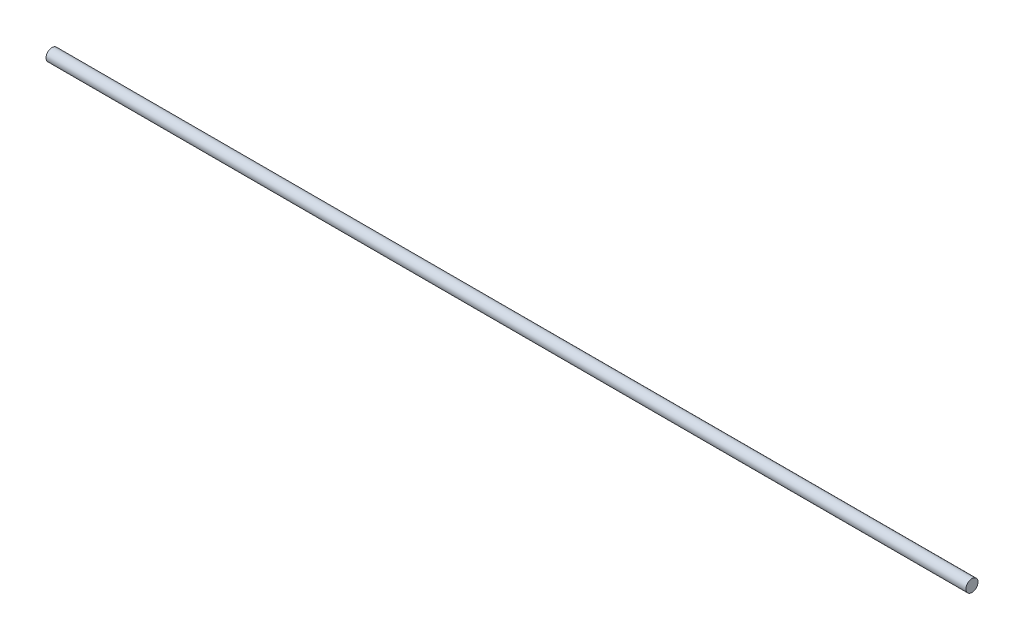
ISO-10303-21;
HEADER;
FILE_DESCRIPTION(('STEP AP214'),'2;1');
FILE_NAME('part.step','',(''),(''),'','','');
FILE_SCHEMA(('AUTOMOTIVE_DESIGN { 1 0 10303 214 1 1 1 1 }'));
ENDSEC;
DATA;
#1=APPLICATION_CONTEXT('core data for automotive mechanical design processes');
#2=APPLICATION_PROTOCOL_DEFINITION('international standard','automotive_design',2000,#1);
#3=PRODUCT_CONTEXT('',#1,'mechanical');
#4=PRODUCT('Part','Part','',(#3));
#5=PRODUCT_RELATED_PRODUCT_CATEGORY('part','',(#4));
#6=PRODUCT_DEFINITION_FORMATION('','',#4);
#7=PRODUCT_DEFINITION_CONTEXT('part definition',#1,'design');
#8=PRODUCT_DEFINITION('design','',#6,#7);
#9=PRODUCT_DEFINITION_SHAPE('','',#8);
#10=(LENGTH_UNIT() NAMED_UNIT(*) SI_UNIT(.MILLI.,.METRE.));
#11=(NAMED_UNIT(*) PLANE_ANGLE_UNIT() SI_UNIT($,.RADIAN.));
#12=(NAMED_UNIT(*) SI_UNIT($,.STERADIAN.) SOLID_ANGLE_UNIT());
#13=UNCERTAINTY_MEASURE_WITH_UNIT(LENGTH_MEASURE(1.E-05),#10,'distance_accuracy_value','');
#14=(GEOMETRIC_REPRESENTATION_CONTEXT(3) GLOBAL_UNCERTAINTY_ASSIGNED_CONTEXT((#13)) GLOBAL_UNIT_ASSIGNED_CONTEXT((#10,
#11,#12)) REPRESENTATION_CONTEXT('',''));
#15=CARTESIAN_POINT('',(0.,0.,0.));
#16=DIRECTION('',(0.,0.,1.));
#17=DIRECTION('',(1.,0.,0.));
#18=AXIS2_PLACEMENT_3D('',#15,#16,#17);
#19=CARTESIAN_POINT('',(457.2,0.,0.));
#20=DIRECTION('',(-1.,0.,0.));
#21=DIRECTION('',(0.,0.,1.));
#22=AXIS2_PLACEMENT_3D('',#19,#20,#21);
#23=CYLINDRICAL_SURFACE('',#22,6.);
#24=CARTESIAN_POINT('',(457.2,0.,0.));
#25=DIRECTION('',(1.,0.,0.));
#26=DIRECTION('',(0.,0.,-1.));
#27=AXIS2_PLACEMENT_3D('',#24,#25,#26);
#28=CIRCLE('',#27,6.);
#29=CARTESIAN_POINT('',(457.2,0.,6.));
#30=VERTEX_POINT('',#29);
#31=EDGE_CURVE('E10',#30,#30,#28,.T.);
#32=CARTESIAN_POINT('',(-457.2,0.,0.));
#33=DIRECTION('',(1.,0.,0.));
#34=DIRECTION('',(0.,0.,-1.));
#35=AXIS2_PLACEMENT_3D('',#32,#33,#34);
#36=CIRCLE('',#35,6.);
#37=CARTESIAN_POINT('',(-457.2,0.,6.));
#38=VERTEX_POINT('',#37);
#39=EDGE_CURVE('E34',#38,#38,#36,.T.);
#40=CARTESIAN_POINT('',(457.2,0.,6.));
#41=CARTESIAN_POINT('',(447.675,0.,6.));
#42=CARTESIAN_POINT('',(438.15,0.,6.));
#43=CARTESIAN_POINT('',(419.1,0.,6.));
#44=CARTESIAN_POINT('',(409.575,0.,6.));
#45=CARTESIAN_POINT('',(390.525,0.,6.));
#46=CARTESIAN_POINT('',(381.,0.,6.));
#47=CARTESIAN_POINT('',(361.95,0.,6.));
#48=CARTESIAN_POINT('',(352.425,0.,6.));
#49=CARTESIAN_POINT('',(333.375,0.,6.));
#50=CARTESIAN_POINT('',(323.85,0.,6.));
#51=CARTESIAN_POINT('',(304.8,0.,6.));
#52=CARTESIAN_POINT('',(295.275,0.,6.));
#53=CARTESIAN_POINT('',(276.225,0.,6.));
#54=CARTESIAN_POINT('',(266.7,0.,6.));
#55=CARTESIAN_POINT('',(247.65,0.,6.));
#56=CARTESIAN_POINT('',(238.125,0.,6.));
#57=CARTESIAN_POINT('',(219.075,0.,6.));
#58=CARTESIAN_POINT('',(209.55,0.,6.));
#59=CARTESIAN_POINT('',(190.5,0.,6.));
#60=CARTESIAN_POINT('',(180.975,0.,6.));
#61=CARTESIAN_POINT('',(161.925,0.,6.));
#62=CARTESIAN_POINT('',(152.4,0.,6.));
#63=CARTESIAN_POINT('',(133.35,0.,6.));
#64=CARTESIAN_POINT('',(123.825,0.,6.));
#65=CARTESIAN_POINT('',(104.775,0.,6.));
#66=CARTESIAN_POINT('',(95.2499999999999,0.,6.));
#67=CARTESIAN_POINT('',(76.1999999999999,0.,6.));
#68=CARTESIAN_POINT('',(66.6749999999999,0.,6.));
#69=CARTESIAN_POINT('',(47.6249999999999,0.,6.));
#70=CARTESIAN_POINT('',(38.0999999999999,0.,6.));
#71=CARTESIAN_POINT('',(19.0499999999999,0.,6.));
#72=CARTESIAN_POINT('',(9.5249999999999,0.,6.));
#73=CARTESIAN_POINT('',(-9.52500000000012,0.,6.));
#74=CARTESIAN_POINT('',(-19.0500000000001,0.,6.));
#75=CARTESIAN_POINT('',(-38.1000000000001,0.,6.));
#76=CARTESIAN_POINT('',(-47.6250000000001,0.,6.));
#77=CARTESIAN_POINT('',(-66.675,0.,6.));
#78=CARTESIAN_POINT('',(-76.2,0.,6.));
#79=CARTESIAN_POINT('',(-95.2500000000001,0.,6.));
#80=CARTESIAN_POINT('',(-104.775,0.,6.));
#81=CARTESIAN_POINT('',(-123.825,0.,6.));
#82=CARTESIAN_POINT('',(-133.35,0.,6.));
#83=CARTESIAN_POINT('',(-152.4,0.,6.));
#84=CARTESIAN_POINT('',(-161.925,0.,6.));
#85=CARTESIAN_POINT('',(-180.975,0.,6.));
#86=CARTESIAN_POINT('',(-190.5,0.,6.));
#87=CARTESIAN_POINT('',(-209.55,0.,6.));
#88=CARTESIAN_POINT('',(-219.075,0.,6.));
#89=CARTESIAN_POINT('',(-238.125,0.,6.));
#90=CARTESIAN_POINT('',(-247.65,0.,6.));
#91=CARTESIAN_POINT('',(-266.7,0.,6.));
#92=CARTESIAN_POINT('',(-276.225,0.,6.));
#93=CARTESIAN_POINT('',(-295.275,0.,6.));
#94=CARTESIAN_POINT('',(-304.8,0.,6.));
#95=CARTESIAN_POINT('',(-323.85,0.,6.));
#96=CARTESIAN_POINT('',(-333.375,0.,6.));
#97=CARTESIAN_POINT('',(-352.425,0.,6.));
#98=CARTESIAN_POINT('',(-361.95,0.,6.));
#99=CARTESIAN_POINT('',(-381.,0.,6.));
#100=CARTESIAN_POINT('',(-390.525,0.,6.));
#101=CARTESIAN_POINT('',(-409.575,0.,6.));
#102=CARTESIAN_POINT('',(-419.1,0.,6.));
#103=CARTESIAN_POINT('',(-438.15,0.,6.));
#104=CARTESIAN_POINT('',(-447.675,0.,6.));
#105=CARTESIAN_POINT('',(-457.2,0.,6.));
#106=B_SPLINE_CURVE_WITH_KNOTS('',3,(#40,#41,#42,#43,#44,#45,#46,#47,#48,#49,#50,#51,#52,#53,
#54,#55,#56,#57,#58,#59,#60,#61,#62,#63,#64,#65,#66,#67,#68,#69,#70,#71,#72,#73,#74,#75,#76,#77,
#78,#79,#80,#81,#82,#83,#84,#85,#86,#87,#88,#89,#90,#91,#92,#93,#94,#95,#96,#97,#98,#99,#100,
#101,#102,#103,#104,#105),.UNSPECIFIED.,.F.,.F.,(4,2,2,2,2,2,2,2,2,2,2,2,2,2,2,2,2,2,2,2,2,2,2,
2,2,2,2,2,2,2,2,2,4),(0.,28.575,57.15,85.725,114.3,142.875,171.45,200.025,228.6,257.175,285.75,
314.325,342.9,371.475,400.05,428.625,457.2,485.775,514.35,542.925,571.5,600.075,628.65,657.225,
685.8,714.375,742.95,771.525,800.1,828.675,857.25,885.825,914.4),.UNSPECIFIED.);
#107=EDGE_CURVE('BSEAM31',#30,#38,#106,.T.);
#108=ORIENTED_EDGE('',*,*,#31,.F.);
#109=ORIENTED_EDGE('',*,*,#39,.T.);
#110=ORIENTED_EDGE('',*,*,#107,.T.);
#111=ORIENTED_EDGE('',*,*,#107,.F.);
#112=EDGE_LOOP('',(#108,#110,#109,#111));
#113=FACE_BOUND('',#112,.T.);
#114=ADVANCED_FACE('F31',(#113),#23,.T.);
#115=CARTESIAN_POINT('',(457.2,0.,0.));
#116=DIRECTION('',(1.,0.,0.));
#117=DIRECTION('',(0.,0.,-1.));
#118=AXIS2_PLACEMENT_3D('',#115,#116,#117);
#119=PLANE('',#118);
#120=ORIENTED_EDGE('',*,*,#31,.T.);
#121=EDGE_LOOP('',(#120));
#122=FACE_BOUND('',#121,.T.);
#123=ADVANCED_FACE('F46',(#122),#119,.T.);
#124=CARTESIAN_POINT('',(-457.2,0.,0.));
#125=DIRECTION('',(1.,0.,0.));
#126=DIRECTION('',(0.,0.,-1.));
#127=AXIS2_PLACEMENT_3D('',#124,#125,#126);
#128=PLANE('',#127);
#129=ORIENTED_EDGE('',*,*,#39,.F.);
#130=EDGE_LOOP('',(#129));
#131=FACE_BOUND('',#130,.T.);
#132=ADVANCED_FACE('F44',(#131),#128,.F.);
#133=CLOSED_SHELL('',(#114,#123,#132));
#134=MANIFOLD_SOLID_BREP('B2',#133);
#135=ADVANCED_BREP_SHAPE_REPRESENTATION('',(#18,#134),#14);
#136=SHAPE_DEFINITION_REPRESENTATION(#9,#135);
ENDSEC;
END-ISO-10303-21;
